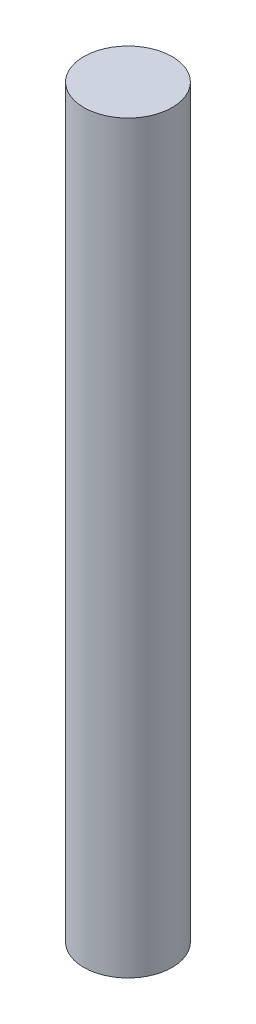
ISO-10303-21;
HEADER;
FILE_DESCRIPTION(('STEP AP214'),'2;1');
FILE_NAME('part.step','',(''),(''),'','','');
FILE_SCHEMA(('AUTOMOTIVE_DESIGN { 1 0 10303 214 1 1 1 1 }'));
ENDSEC;
DATA;
#1=APPLICATION_CONTEXT('core data for automotive mechanical design processes');
#2=APPLICATION_PROTOCOL_DEFINITION('international standard','automotive_design',2000,#1);
#3=PRODUCT_CONTEXT('',#1,'mechanical');
#4=PRODUCT('Part','Part','',(#3));
#5=PRODUCT_RELATED_PRODUCT_CATEGORY('part','',(#4));
#6=PRODUCT_DEFINITION_FORMATION('','',#4);
#7=PRODUCT_DEFINITION_CONTEXT('part definition',#1,'design');
#8=PRODUCT_DEFINITION('design','',#6,#7);
#9=PRODUCT_DEFINITION_SHAPE('','',#8);
#10=(LENGTH_UNIT() NAMED_UNIT(*) SI_UNIT(.MILLI.,.METRE.));
#11=(NAMED_UNIT(*) PLANE_ANGLE_UNIT() SI_UNIT($,.RADIAN.));
#12=(NAMED_UNIT(*) SI_UNIT($,.STERADIAN.) SOLID_ANGLE_UNIT());
#13=UNCERTAINTY_MEASURE_WITH_UNIT(LENGTH_MEASURE(1.E-05),#10,'distance_accuracy_value','');
#14=(GEOMETRIC_REPRESENTATION_CONTEXT(3) GLOBAL_UNCERTAINTY_ASSIGNED_CONTEXT((#13)) GLOBAL_UNIT_ASSIGNED_CONTEXT((#10,
#11,#12)) REPRESENTATION_CONTEXT('',''));
#15=CARTESIAN_POINT('',(0.,0.,0.));
#16=DIRECTION('',(0.,0.,1.));
#17=DIRECTION('',(1.,0.,0.));
#18=AXIS2_PLACEMENT_3D('',#15,#16,#17);
#19=CARTESIAN_POINT('',(0.,50.6,0.));
#20=DIRECTION('',(0.,-1.,0.));
#21=DIRECTION('',(0.,0.,-1.));
#22=AXIS2_PLACEMENT_3D('',#19,#20,#21);
#23=CYLINDRICAL_SURFACE('',#22,3.);
#24=CARTESIAN_POINT('',(0.,50.6,0.));
#25=DIRECTION('',(0.,1.,0.));
#26=DIRECTION('',(0.,0.,1.));
#27=AXIS2_PLACEMENT_3D('',#24,#25,#26);
#28=CIRCLE('',#27,3.);
#29=CARTESIAN_POINT('',(0.,50.6,3.));
#30=VERTEX_POINT('',#29);
#31=EDGE_CURVE('E10',#30,#30,#28,.T.);
#32=ORIENTED_EDGE('',*,*,#31,.F.);
#33=EDGE_LOOP('',(#32));
#34=FACE_BOUND('',#33,.T.);
#35=CARTESIAN_POINT('',(0.,0.,0.));
#36=DIRECTION('',(0.,1.,0.));
#37=DIRECTION('',(0.,0.,1.));
#38=AXIS2_PLACEMENT_3D('',#35,#36,#37);
#39=CIRCLE('',#38,3.);
#40=CARTESIAN_POINT('',(0.,0.,3.));
#41=VERTEX_POINT('',#40);
#42=EDGE_CURVE('E34',#41,#41,#39,.T.);
#43=ORIENTED_EDGE('',*,*,#42,.T.);
#44=EDGE_LOOP('',(#43));
#45=FACE_BOUND('',#44,.T.);
#46=ADVANCED_FACE('F31',(#34,#45),#23,.T.);
#47=CARTESIAN_POINT('',(0.,50.6,0.));
#48=DIRECTION('',(0.,1.,0.));
#49=DIRECTION('',(0.,0.,1.));
#50=AXIS2_PLACEMENT_3D('',#47,#48,#49);
#51=PLANE('',#50);
#52=ORIENTED_EDGE('',*,*,#31,.T.);
#53=EDGE_LOOP('',(#52));
#54=FACE_BOUND('',#53,.T.);
#55=ADVANCED_FACE('F46',(#54),#51,.T.);
#56=CARTESIAN_POINT('',(0.,0.,0.));
#57=DIRECTION('',(0.,1.,0.));
#58=DIRECTION('',(0.,0.,1.));
#59=AXIS2_PLACEMENT_3D('',#56,#57,#58);
#60=PLANE('',#59);
#61=ORIENTED_EDGE('',*,*,#42,.F.);
#62=EDGE_LOOP('',(#61));
#63=FACE_BOUND('',#62,.T.);
#64=ADVANCED_FACE('F44',(#63),#60,.F.);
#65=CLOSED_SHELL('',(#46,#55,#64));
#66=MANIFOLD_SOLID_BREP('B2',#65);
#67=ADVANCED_BREP_SHAPE_REPRESENTATION('',(#18,#66),#14);
#68=SHAPE_DEFINITION_REPRESENTATION(#9,#67);
ENDSEC;
END-ISO-10303-21;
